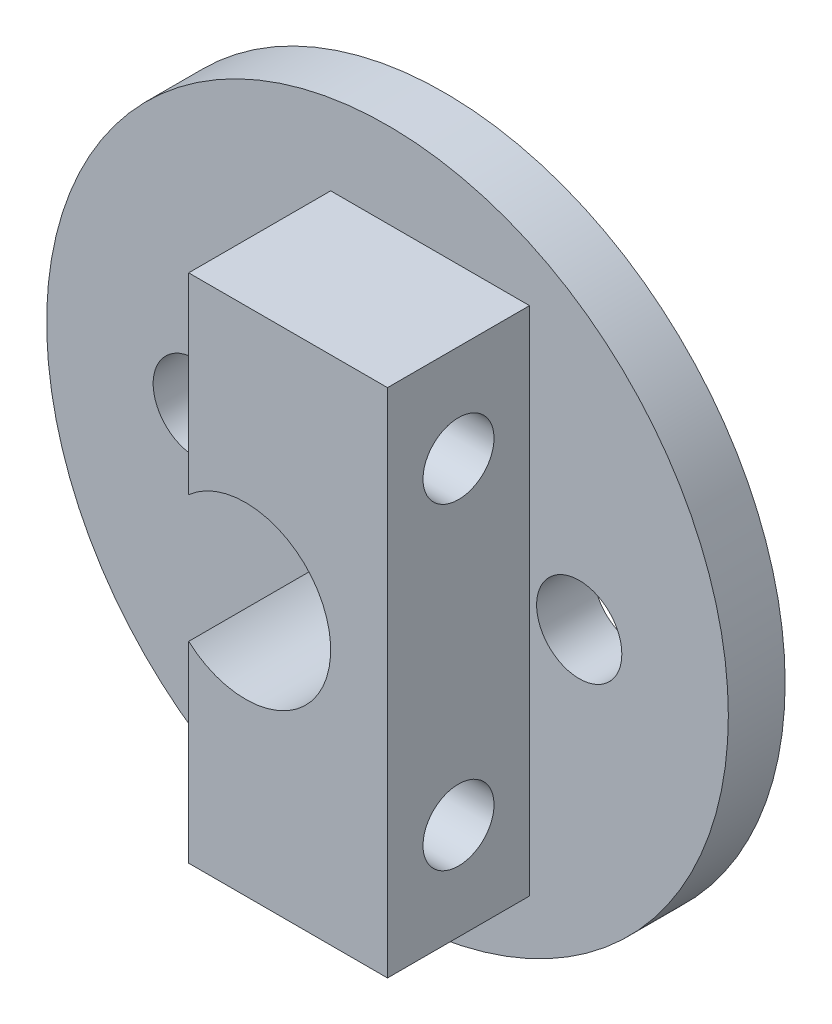
ISO-10303-21;
HEADER;
FILE_DESCRIPTION(('STEP AP214'),'2;1');
FILE_NAME('part.step','',(''),(''),'','','');
FILE_SCHEMA(('AUTOMOTIVE_DESIGN { 1 0 10303 214 1 1 1 1 }'));
ENDSEC;
DATA;
#1=APPLICATION_CONTEXT('core data for automotive mechanical design processes');
#2=APPLICATION_PROTOCOL_DEFINITION('international standard','automotive_design',2000,#1);
#3=PRODUCT_CONTEXT('',#1,'mechanical');
#4=PRODUCT('Part','Part','',(#3));
#5=PRODUCT_RELATED_PRODUCT_CATEGORY('part','',(#4));
#6=PRODUCT_DEFINITION_FORMATION('','',#4);
#7=PRODUCT_DEFINITION_CONTEXT('part definition',#1,'design');
#8=PRODUCT_DEFINITION('design','',#6,#7);
#9=PRODUCT_DEFINITION_SHAPE('','',#8);
#10=(LENGTH_UNIT() NAMED_UNIT(*) SI_UNIT(.MILLI.,.METRE.));
#11=(NAMED_UNIT(*) PLANE_ANGLE_UNIT() SI_UNIT($,.RADIAN.));
#12=(NAMED_UNIT(*) SI_UNIT($,.STERADIAN.) SOLID_ANGLE_UNIT());
#13=UNCERTAINTY_MEASURE_WITH_UNIT(LENGTH_MEASURE(1.E-05),#10,'distance_accuracy_value','');
#14=(GEOMETRIC_REPRESENTATION_CONTEXT(3) GLOBAL_UNCERTAINTY_ASSIGNED_CONTEXT((#13)) GLOBAL_UNIT_ASSIGNED_CONTEXT((#10,
#11,#12)) REPRESENTATION_CONTEXT('',''));
#15=CARTESIAN_POINT('',(0.,0.,0.));
#16=DIRECTION('',(0.,0.,1.));
#17=DIRECTION('',(1.,0.,0.));
#18=AXIS2_PLACEMENT_3D('',#15,#16,#17);
#19=CARTESIAN_POINT('',(0.,0.,2.));
#20=DIRECTION('',(0.,0.,1.));
#21=DIRECTION('',(1.,0.,0.));
#22=AXIS2_PLACEMENT_3D('',#19,#20,#21);
#23=PLANE('',#22);
#24=DIRECTION('',(0.,-1.,0.));
#25=VECTOR('',#24,1.);
#26=CARTESIAN_POINT('',(-2.,9.,2.));
#27=LINE('',#26,#25);
#28=CARTESIAN_POINT('',(-2.,9.,2.));
#29=VERTEX_POINT('',#28);
#30=CARTESIAN_POINT('',(-2.,2.23606797749979,2.));
#31=VERTEX_POINT('',#30);
#32=EDGE_CURVE('E48',#29,#31,#27,.T.);
#33=ORIENTED_EDGE('',*,*,#32,.F.);
#34=DIRECTION('',(-1.,0.,0.));
#35=VECTOR('',#34,1.);
#36=CARTESIAN_POINT('',(-2.,9.,2.));
#37=LINE('',#36,#35);
#38=CARTESIAN_POINT('',(5.,9.,2.));
#39=VERTEX_POINT('',#38);
#40=EDGE_CURVE('E52',#39,#29,#37,.T.);
#41=ORIENTED_EDGE('',*,*,#40,.F.);
#42=DIRECTION('',(0.,1.,0.));
#43=VECTOR('',#42,1.);
#44=CARTESIAN_POINT('',(5.,9.,2.));
#45=LINE('',#44,#43);
#46=CARTESIAN_POINT('',(5.,-9.,2.));
#47=VERTEX_POINT('',#46);
#48=EDGE_CURVE('E129',#47,#39,#45,.T.);
#49=ORIENTED_EDGE('',*,*,#48,.F.);
#50=DIRECTION('',(1.,0.,0.));
#51=VECTOR('',#50,1.);
#52=CARTESIAN_POINT('',(-2.,-9.,2.));
#53=LINE('',#52,#51);
#54=CARTESIAN_POINT('',(-2.,-9.,2.));
#55=VERTEX_POINT('',#54);
#56=EDGE_CURVE('E126',#55,#47,#53,.T.);
#57=ORIENTED_EDGE('',*,*,#56,.F.);
#58=DIRECTION('',(0.,-1.,0.));
#59=VECTOR('',#58,1.);
#60=CARTESIAN_POINT('',(-2.,-2.23606797749979,2.));
#61=LINE('',#60,#59);
#62=CARTESIAN_POINT('',(-2.,-2.23606797749979,2.));
#63=VERTEX_POINT('',#62);
#64=EDGE_CURVE('E120',#63,#55,#61,.T.);
#65=ORIENTED_EDGE('',*,*,#64,.F.);
#66=CARTESIAN_POINT('',(0.,0.,2.));
#67=DIRECTION('',(0.,0.,1.));
#68=DIRECTION('',(1.,0.,0.));
#69=AXIS2_PLACEMENT_3D('',#66,#67,#68);
#70=CIRCLE('',#69,3.);
#71=EDGE_CURVE('E110',#31,#63,#70,.T.);
#72=ORIENTED_EDGE('',*,*,#71,.F.);
#73=EDGE_LOOP('',(#33,#41,#49,#57,#65,#72));
#74=FACE_BOUND('',#73,.T.);
#75=CARTESIAN_POINT('',(6.75,0.,2.));
#76=DIRECTION('',(0.,0.,1.));
#77=DIRECTION('',(1.,0.,0.));
#78=AXIS2_PLACEMENT_3D('',#75,#76,#77);
#79=CIRCLE('',#78,1.5);
#80=CARTESIAN_POINT('',(8.25,0.,2.));
#81=VERTEX_POINT('',#80);
#82=EDGE_CURVE('E142',#81,#81,#79,.T.);
#83=ORIENTED_EDGE('',*,*,#82,.F.);
#84=EDGE_LOOP('',(#83));
#85=FACE_BOUND('',#84,.T.);
#86=CARTESIAN_POINT('',(0.,0.,2.));
#87=DIRECTION('',(0.,0.,1.));
#88=DIRECTION('',(1.,0.,0.));
#89=AXIS2_PLACEMENT_3D('',#86,#87,#88);
#90=CIRCLE('',#89,12.);
#91=CARTESIAN_POINT('',(12.,0.,2.));
#92=VERTEX_POINT('',#91);
#93=EDGE_CURVE('E11',#92,#92,#90,.T.);
#94=ORIENTED_EDGE('',*,*,#93,.T.);
#95=EDGE_LOOP('',(#94));
#96=FACE_BOUND('',#95,.T.);
#97=CARTESIAN_POINT('',(-6.75,0.,2.));
#98=DIRECTION('',(0.,0.,1.));
#99=DIRECTION('',(1.,0.,0.));
#100=AXIS2_PLACEMENT_3D('',#97,#98,#99);
#101=CIRCLE('',#100,1.5);
#102=CARTESIAN_POINT('',(-5.25,0.,2.));
#103=VERTEX_POINT('',#102);
#104=EDGE_CURVE('E149',#103,#103,#101,.T.);
#105=ORIENTED_EDGE('',*,*,#104,.F.);
#106=EDGE_LOOP('',(#105));
#107=FACE_BOUND('',#106,.T.);
#108=ADVANCED_FACE('F31',(#74,#85,#96,#107),#23,.T.);
#109=CARTESIAN_POINT('',(0.,0.,0.));
#110=DIRECTION('',(0.,0.,1.));
#111=DIRECTION('',(1.,0.,0.));
#112=AXIS2_PLACEMENT_3D('',#109,#110,#111);
#113=PLANE('',#112);
#114=CARTESIAN_POINT('',(6.75,0.,0.));
#115=DIRECTION('',(0.,0.,1.));
#116=DIRECTION('',(1.,0.,0.));
#117=AXIS2_PLACEMENT_3D('',#114,#115,#116);
#118=CIRCLE('',#117,1.5);
#119=CARTESIAN_POINT('',(8.25,0.,0.));
#120=VERTEX_POINT('',#119);
#121=EDGE_CURVE('E146',#120,#120,#118,.T.);
#122=ORIENTED_EDGE('',*,*,#121,.T.);
#123=EDGE_LOOP('',(#122));
#124=FACE_BOUND('',#123,.T.);
#125=CARTESIAN_POINT('',(0.,0.,0.));
#126=DIRECTION('',(0.,0.,1.));
#127=DIRECTION('',(1.,0.,0.));
#128=AXIS2_PLACEMENT_3D('',#125,#126,#127);
#129=CIRCLE('',#128,12.);
#130=CARTESIAN_POINT('',(12.,0.,0.));
#131=VERTEX_POINT('',#130);
#132=EDGE_CURVE('E40',#131,#131,#129,.T.);
#133=ORIENTED_EDGE('',*,*,#132,.F.);
#134=EDGE_LOOP('',(#133));
#135=FACE_BOUND('',#134,.T.);
#136=CARTESIAN_POINT('',(-6.75,0.,0.));
#137=DIRECTION('',(0.,0.,1.));
#138=DIRECTION('',(1.,0.,0.));
#139=AXIS2_PLACEMENT_3D('',#136,#137,#138);
#140=CIRCLE('',#139,1.5);
#141=CARTESIAN_POINT('',(-5.25,0.,0.));
#142=VERTEX_POINT('',#141);
#143=EDGE_CURVE('E145',#142,#142,#140,.T.);
#144=ORIENTED_EDGE('',*,*,#143,.T.);
#145=EDGE_LOOP('',(#144));
#146=FACE_BOUND('',#145,.T.);
#147=CARTESIAN_POINT('',(0.,0.,0.));
#148=DIRECTION('',(0.,0.,1.));
#149=DIRECTION('',(1.,0.,0.));
#150=AXIS2_PLACEMENT_3D('',#147,#148,#149);
#151=CIRCLE('',#150,3.);
#152=CARTESIAN_POINT('',(3.,0.,0.));
#153=VERTEX_POINT('',#152);
#154=EDGE_CURVE('E107',#153,#153,#151,.T.);
#155=ORIENTED_EDGE('',*,*,#154,.T.);
#156=EDGE_LOOP('',(#155));
#157=FACE_BOUND('',#156,.T.);
#158=ADVANCED_FACE('F198',(#124,#135,#146,#157),#113,.F.);
#159=CARTESIAN_POINT('',(0.,0.,2.));
#160=DIRECTION('',(0.,0.,-1.));
#161=DIRECTION('',(-1.,0.,0.));
#162=AXIS2_PLACEMENT_3D('',#159,#160,#161);
#163=CYLINDRICAL_SURFACE('',#162,12.);
#164=ORIENTED_EDGE('',*,*,#93,.F.);
#165=EDGE_LOOP('',(#164));
#166=FACE_BOUND('',#165,.T.);
#167=ORIENTED_EDGE('',*,*,#132,.T.);
#168=EDGE_LOOP('',(#167));
#169=FACE_BOUND('',#168,.T.);
#170=ADVANCED_FACE('F33',(#166,#169),#163,.T.);
#171=CARTESIAN_POINT('',(-6.75,0.,2.));
#172=DIRECTION('',(0.,0.,-1.));
#173=DIRECTION('',(-1.,0.,0.));
#174=AXIS2_PLACEMENT_3D('',#171,#172,#173);
#175=CYLINDRICAL_SURFACE('',#174,1.5);
#176=ORIENTED_EDGE('',*,*,#104,.T.);
#177=EDGE_LOOP('',(#176));
#178=FACE_BOUND('',#177,.T.);
#179=ORIENTED_EDGE('',*,*,#143,.F.);
#180=EDGE_LOOP('',(#179));
#181=FACE_BOUND('',#180,.T.);
#182=ADVANCED_FACE('F208',(#178,#181),#175,.F.);
#183=CARTESIAN_POINT('',(6.75,0.,2.));
#184=DIRECTION('',(0.,0.,-1.));
#185=DIRECTION('',(-1.,0.,0.));
#186=AXIS2_PLACEMENT_3D('',#183,#184,#185);
#187=CYLINDRICAL_SURFACE('',#186,1.5);
#188=ORIENTED_EDGE('',*,*,#82,.T.);
#189=EDGE_LOOP('',(#188));
#190=FACE_BOUND('',#189,.T.);
#191=ORIENTED_EDGE('',*,*,#121,.F.);
#192=EDGE_LOOP('',(#191));
#193=FACE_BOUND('',#192,.T.);
#194=ADVANCED_FACE('F211',(#190,#193),#187,.F.);
#195=CARTESIAN_POINT('',(0.,0.,2.));
#196=DIRECTION('',(0.,0.,-1.));
#197=DIRECTION('',(-1.,0.,0.));
#198=AXIS2_PLACEMENT_3D('',#195,#196,#197);
#199=CYLINDRICAL_SURFACE('',#198,3.);
#200=ORIENTED_EDGE('',*,*,#71,.T.);
#201=DIRECTION('',(0.,0.,-1.));
#202=VECTOR('',#201,1.);
#203=CARTESIAN_POINT('',(-2.,-2.23606797749979,7.));
#204=LINE('',#203,#202);
#205=CARTESIAN_POINT('',(-2.,-2.23606797749979,7.));
#206=VERTEX_POINT('',#205);
#207=EDGE_CURVE('E92',#206,#63,#204,.T.);
#208=ORIENTED_EDGE('',*,*,#207,.F.);
#209=CARTESIAN_POINT('',(0.,0.,7.));
#210=DIRECTION('',(0.,0.,-1.));
#211=DIRECTION('',(1.,0.,0.));
#212=AXIS2_PLACEMENT_3D('',#209,#210,#211);
#213=CIRCLE('',#212,3.);
#214=CARTESIAN_POINT('',(-2.,2.23606797749979,7.));
#215=VERTEX_POINT('',#214);
#216=EDGE_CURVE('E84',#215,#206,#213,.T.);
#217=ORIENTED_EDGE('',*,*,#216,.F.);
#218=DIRECTION('',(0.,0.,-1.));
#219=VECTOR('',#218,1.);
#220=CARTESIAN_POINT('',(-2.,2.23606797749979,7.));
#221=LINE('',#220,#219);
#222=EDGE_CURVE('E90',#215,#31,#221,.T.);
#223=ORIENTED_EDGE('',*,*,#222,.T.);
#224=EDGE_LOOP('',(#200,#208,#217,#223));
#225=FACE_BOUND('',#224,.T.);
#226=ORIENTED_EDGE('',*,*,#154,.F.);
#227=EDGE_LOOP('',(#226));
#228=FACE_BOUND('',#227,.T.);
#229=ADVANCED_FACE('F87',(#225,#228),#199,.F.);
#230=CARTESIAN_POINT('',(-2.,9.,7.));
#231=DIRECTION('',(1.,0.,0.));
#232=DIRECTION('',(0.,1.,0.));
#233=AXIS2_PLACEMENT_3D('',#230,#231,#232);
#234=PLANE('',#233);
#235=CARTESIAN_POINT('',(-2.,5.58606797749979,4.5));
#236=DIRECTION('',(-1.,0.,0.));
#237=DIRECTION('',(0.,-1.,0.));
#238=AXIS2_PLACEMENT_3D('',#235,#236,#237);
#239=CIRCLE('',#238,1.25);
#240=CARTESIAN_POINT('',(-2.,4.33606797749979,4.5));
#241=VERTEX_POINT('',#240);
#242=EDGE_CURVE('E175',#241,#241,#239,.T.);
#243=ORIENTED_EDGE('',*,*,#242,.F.);
#244=EDGE_LOOP('',(#243));
#245=FACE_BOUND('',#244,.T.);
#246=ORIENTED_EDGE('',*,*,#32,.T.);
#247=ORIENTED_EDGE('',*,*,#222,.F.);
#248=DIRECTION('',(0.,-1.,0.));
#249=VECTOR('',#248,1.);
#250=CARTESIAN_POINT('',(-2.,9.,7.));
#251=LINE('',#250,#249);
#252=CARTESIAN_POINT('',(-2.,9.,7.));
#253=VERTEX_POINT('',#252);
#254=EDGE_CURVE('E96',#253,#215,#251,.T.);
#255=ORIENTED_EDGE('',*,*,#254,.F.);
#256=DIRECTION('',(0.,0.,-1.));
#257=VECTOR('',#256,1.);
#258=CARTESIAN_POINT('',(-2.,9.,7.));
#259=LINE('',#258,#257);
#260=EDGE_CURVE('E132',#253,#29,#259,.T.);
#261=ORIENTED_EDGE('',*,*,#260,.T.);
#262=EDGE_LOOP('',(#246,#247,#255,#261));
#263=FACE_BOUND('',#262,.T.);
#264=ADVANCED_FACE('F106',(#245,#263),#234,.F.);
#265=CARTESIAN_POINT('',(-2.,-2.23606797749979,7.));
#266=DIRECTION('',(1.,0.,0.));
#267=DIRECTION('',(0.,1.,0.));
#268=AXIS2_PLACEMENT_3D('',#265,#266,#267);
#269=PLANE('',#268);
#270=CARTESIAN_POINT('',(-2.,-5.58606797749979,4.5));
#271=DIRECTION('',(-1.,0.,0.));
#272=DIRECTION('',(0.,1.,0.));
#273=AXIS2_PLACEMENT_3D('',#270,#271,#272);
#274=CIRCLE('',#273,1.25);
#275=CARTESIAN_POINT('',(-2.,-4.33606797749979,4.5));
#276=VERTEX_POINT('',#275);
#277=EDGE_CURVE('E178',#276,#276,#274,.T.);
#278=ORIENTED_EDGE('',*,*,#277,.F.);
#279=EDGE_LOOP('',(#278));
#280=FACE_BOUND('',#279,.T.);
#281=ORIENTED_EDGE('',*,*,#64,.T.);
#282=DIRECTION('',(0.,0.,-1.));
#283=VECTOR('',#282,1.);
#284=CARTESIAN_POINT('',(-2.,-9.,7.));
#285=LINE('',#284,#283);
#286=CARTESIAN_POINT('',(-2.,-9.,7.));
#287=VERTEX_POINT('',#286);
#288=EDGE_CURVE('E112',#287,#55,#285,.T.);
#289=ORIENTED_EDGE('',*,*,#288,.F.);
#290=DIRECTION('',(0.,-1.,0.));
#291=VECTOR('',#290,1.);
#292=CARTESIAN_POINT('',(-2.,-2.23606797749979,7.));
#293=LINE('',#292,#291);
#294=EDGE_CURVE('E95',#206,#287,#293,.T.);
#295=ORIENTED_EDGE('',*,*,#294,.F.);
#296=ORIENTED_EDGE('',*,*,#207,.T.);
#297=EDGE_LOOP('',(#281,#289,#295,#296));
#298=FACE_BOUND('',#297,.T.);
#299=ADVANCED_FACE('F164',(#280,#298),#269,.F.);
#300=CARTESIAN_POINT('',(-2.,-9.,7.));
#301=DIRECTION('',(0.,1.,0.));
#302=DIRECTION('',(0.,0.,1.));
#303=AXIS2_PLACEMENT_3D('',#300,#301,#302);
#304=PLANE('',#303);
#305=ORIENTED_EDGE('',*,*,#56,.T.);
#306=DIRECTION('',(0.,0.,-1.));
#307=VECTOR('',#306,1.);
#308=CARTESIAN_POINT('',(5.,-9.,7.));
#309=LINE('',#308,#307);
#310=CARTESIAN_POINT('',(5.,-9.,7.));
#311=VERTEX_POINT('',#310);
#312=EDGE_CURVE('E137',#311,#47,#309,.T.);
#313=ORIENTED_EDGE('',*,*,#312,.F.);
#314=DIRECTION('',(1.,0.,0.));
#315=VECTOR('',#314,1.);
#316=CARTESIAN_POINT('',(-2.,-9.,7.));
#317=LINE('',#316,#315);
#318=EDGE_CURVE('E169',#287,#311,#317,.T.);
#319=ORIENTED_EDGE('',*,*,#318,.F.);
#320=ORIENTED_EDGE('',*,*,#288,.T.);
#321=EDGE_LOOP('',(#305,#313,#319,#320));
#322=FACE_BOUND('',#321,.T.);
#323=ADVANCED_FACE('F167',(#322),#304,.F.);
#324=CARTESIAN_POINT('',(5.,9.,7.));
#325=DIRECTION('',(-1.,0.,0.));
#326=DIRECTION('',(0.,-1.,0.));
#327=AXIS2_PLACEMENT_3D('',#324,#325,#326);
#328=PLANE('',#327);
#329=CARTESIAN_POINT('',(5.,-5.58606797749979,4.5));
#330=DIRECTION('',(-1.,0.,0.));
#331=DIRECTION('',(0.,-1.,0.));
#332=AXIS2_PLACEMENT_3D('',#329,#330,#331);
#333=CIRCLE('',#332,1.25);
#334=CARTESIAN_POINT('',(5.,-6.83606797749979,4.5));
#335=VERTEX_POINT('',#334);
#336=EDGE_CURVE('E35',#335,#335,#333,.T.);
#337=ORIENTED_EDGE('',*,*,#336,.T.);
#338=EDGE_LOOP('',(#337));
#339=FACE_BOUND('',#338,.T.);
#340=CARTESIAN_POINT('',(5.,5.58606797749979,4.5));
#341=DIRECTION('',(-1.,0.,0.));
#342=DIRECTION('',(0.,-1.,0.));
#343=AXIS2_PLACEMENT_3D('',#340,#341,#342);
#344=CIRCLE('',#343,1.25);
#345=CARTESIAN_POINT('',(5.,4.33606797749979,4.5));
#346=VERTEX_POINT('',#345);
#347=EDGE_CURVE('E121',#346,#346,#344,.T.);
#348=ORIENTED_EDGE('',*,*,#347,.T.);
#349=EDGE_LOOP('',(#348));
#350=FACE_BOUND('',#349,.T.);
#351=ORIENTED_EDGE('',*,*,#48,.T.);
#352=DIRECTION('',(0.,0.,-1.));
#353=VECTOR('',#352,1.);
#354=CARTESIAN_POINT('',(5.,9.,7.));
#355=LINE('',#354,#353);
#356=CARTESIAN_POINT('',(5.,9.,7.));
#357=VERTEX_POINT('',#356);
#358=EDGE_CURVE('E134',#357,#39,#355,.T.);
#359=ORIENTED_EDGE('',*,*,#358,.F.);
#360=DIRECTION('',(0.,1.,0.));
#361=VECTOR('',#360,1.);
#362=CARTESIAN_POINT('',(5.,9.,7.));
#363=LINE('',#362,#361);
#364=EDGE_CURVE('E171',#311,#357,#363,.T.);
#365=ORIENTED_EDGE('',*,*,#364,.F.);
#366=ORIENTED_EDGE('',*,*,#312,.T.);
#367=EDGE_LOOP('',(#351,#359,#365,#366));
#368=FACE_BOUND('',#367,.T.);
#369=ADVANCED_FACE('F185',(#339,#350,#368),#328,.F.);
#370=CARTESIAN_POINT('',(-2.,9.,7.));
#371=DIRECTION('',(0.,-1.,0.));
#372=DIRECTION('',(0.,0.,-1.));
#373=AXIS2_PLACEMENT_3D('',#370,#371,#372);
#374=PLANE('',#373);
#375=ORIENTED_EDGE('',*,*,#40,.T.);
#376=ORIENTED_EDGE('',*,*,#260,.F.);
#377=DIRECTION('',(-1.,0.,0.));
#378=VECTOR('',#377,1.);
#379=CARTESIAN_POINT('',(-2.,9.,7.));
#380=LINE('',#379,#378);
#381=EDGE_CURVE('E101',#357,#253,#380,.T.);
#382=ORIENTED_EDGE('',*,*,#381,.F.);
#383=ORIENTED_EDGE('',*,*,#358,.T.);
#384=EDGE_LOOP('',(#375,#376,#382,#383));
#385=FACE_BOUND('',#384,.T.);
#386=ADVANCED_FACE('F228',(#385),#374,.F.);
#387=CARTESIAN_POINT('',(0.,0.,7.));
#388=DIRECTION('',(0.,0.,1.));
#389=DIRECTION('',(1.,0.,0.));
#390=AXIS2_PLACEMENT_3D('',#387,#388,#389);
#391=PLANE('',#390);
#392=ORIENTED_EDGE('',*,*,#254,.T.);
#393=ORIENTED_EDGE('',*,*,#216,.T.);
#394=ORIENTED_EDGE('',*,*,#294,.T.);
#395=ORIENTED_EDGE('',*,*,#318,.T.);
#396=ORIENTED_EDGE('',*,*,#364,.T.);
#397=ORIENTED_EDGE('',*,*,#381,.T.);
#398=EDGE_LOOP('',(#392,#393,#394,#395,#396,#397));
#399=FACE_BOUND('',#398,.T.);
#400=ADVANCED_FACE('F99',(#399),#391,.T.);
#401=CARTESIAN_POINT('',(12.,5.58606797749979,4.5));
#402=DIRECTION('',(-1.,0.,0.));
#403=DIRECTION('',(0.,-1.,0.));
#404=AXIS2_PLACEMENT_3D('',#401,#402,#403);
#405=CYLINDRICAL_SURFACE('',#404,1.25);
#406=ORIENTED_EDGE('',*,*,#242,.T.);
#407=EDGE_LOOP('',(#406));
#408=FACE_BOUND('',#407,.T.);
#409=ORIENTED_EDGE('',*,*,#347,.F.);
#410=EDGE_LOOP('',(#409));
#411=FACE_BOUND('',#410,.T.);
#412=ADVANCED_FACE('F190',(#408,#411),#405,.F.);
#413=CARTESIAN_POINT('',(12.,-5.58606797749979,4.5));
#414=DIRECTION('',(-1.,0.,0.));
#415=DIRECTION('',(0.,-1.,0.));
#416=AXIS2_PLACEMENT_3D('',#413,#414,#415);
#417=CYLINDRICAL_SURFACE('',#416,1.25);
#418=ORIENTED_EDGE('',*,*,#277,.T.);
#419=EDGE_LOOP('',(#418));
#420=FACE_BOUND('',#419,.T.);
#421=ORIENTED_EDGE('',*,*,#336,.F.);
#422=EDGE_LOOP('',(#421));
#423=FACE_BOUND('',#422,.T.);
#424=ADVANCED_FACE('F188',(#420,#423),#417,.F.);
#425=CLOSED_SHELL('',(#108,#158,#170,#182,#194,#229,#264,#299,#323,#369,#386,#400,#412,#424));
#426=MANIFOLD_SOLID_BREP('B2',#425);
#427=ADVANCED_BREP_SHAPE_REPRESENTATION('',(#18,#426),#14);
#428=SHAPE_DEFINITION_REPRESENTATION(#9,#427);
ENDSEC;
END-ISO-10303-21;
